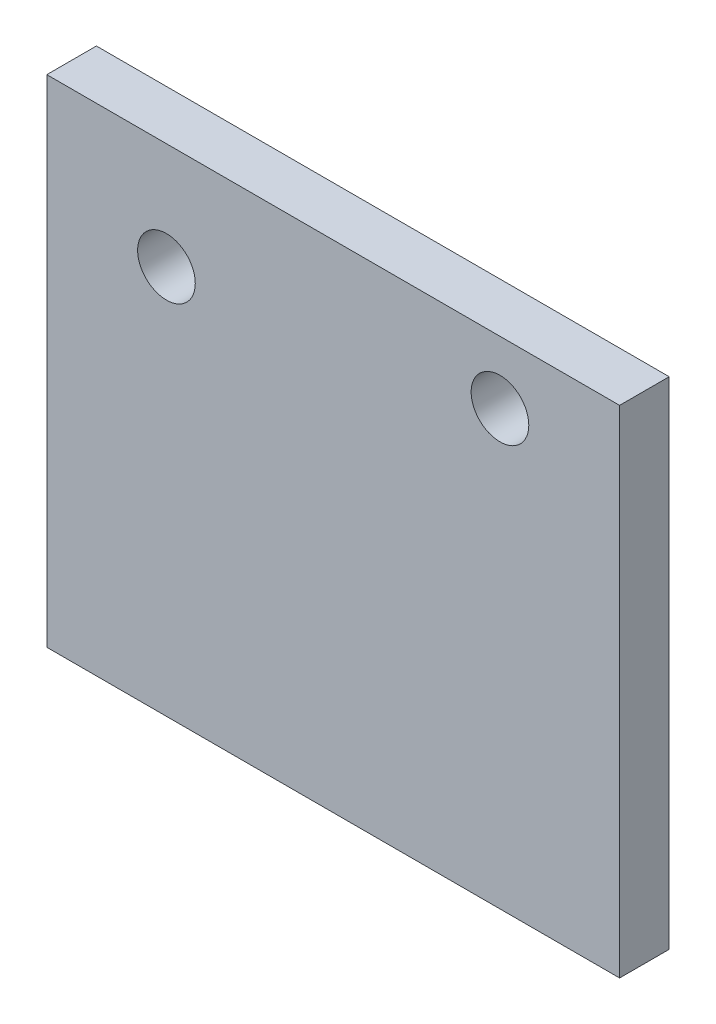
ISO-10303-21;
HEADER;
FILE_DESCRIPTION(('STEP AP214'),'2;1');
FILE_NAME('part.step','',(''),(''),'','','');
FILE_SCHEMA(('AUTOMOTIVE_DESIGN { 1 0 10303 214 1 1 1 1 }'));
ENDSEC;
DATA;
#1=APPLICATION_CONTEXT('core data for automotive mechanical design processes');
#2=APPLICATION_PROTOCOL_DEFINITION('international standard','automotive_design',2000,#1);
#3=PRODUCT_CONTEXT('',#1,'mechanical');
#4=PRODUCT('Part','Part','',(#3));
#5=PRODUCT_RELATED_PRODUCT_CATEGORY('part','',(#4));
#6=PRODUCT_DEFINITION_FORMATION('','',#4);
#7=PRODUCT_DEFINITION_CONTEXT('part definition',#1,'design');
#8=PRODUCT_DEFINITION('design','',#6,#7);
#9=PRODUCT_DEFINITION_SHAPE('','',#8);
#10=(LENGTH_UNIT() NAMED_UNIT(*) SI_UNIT(.MILLI.,.METRE.));
#11=(NAMED_UNIT(*) PLANE_ANGLE_UNIT() SI_UNIT($,.RADIAN.));
#12=(NAMED_UNIT(*) SI_UNIT($,.STERADIAN.) SOLID_ANGLE_UNIT());
#13=UNCERTAINTY_MEASURE_WITH_UNIT(LENGTH_MEASURE(1.E-05),#10,'distance_accuracy_value','');
#14=(GEOMETRIC_REPRESENTATION_CONTEXT(3) GLOBAL_UNCERTAINTY_ASSIGNED_CONTEXT((#13)) GLOBAL_UNIT_ASSIGNED_CONTEXT((#10,
#11,#12)) REPRESENTATION_CONTEXT('',''));
#15=CARTESIAN_POINT('',(0.,0.,0.));
#16=DIRECTION('',(0.,0.,1.));
#17=DIRECTION('',(1.,0.,0.));
#18=AXIS2_PLACEMENT_3D('',#15,#16,#17);
#19=CARTESIAN_POINT('',(0.,0.,40.));
#20=DIRECTION('',(1.,0.,0.));
#21=DIRECTION('',(0.,0.,-1.));
#22=AXIS2_PLACEMENT_3D('',#19,#20,#21);
#23=PLANE('',#22);
#24=DIRECTION('',(0.,-1.,0.));
#25=VECTOR('',#24,1.);
#26=CARTESIAN_POINT('',(0.,0.,0.));
#27=LINE('',#26,#25);
#28=CARTESIAN_POINT('',(0.,0.,0.));
#29=VERTEX_POINT('',#28);
#30=CARTESIAN_POINT('',(0.,-400.,0.));
#31=VERTEX_POINT('',#30);
#32=EDGE_CURVE('E147',#29,#31,#27,.T.);
#33=ORIENTED_EDGE('',*,*,#32,.T.);
#34=DIRECTION('',(0.,0.,-1.));
#35=VECTOR('',#34,1.);
#36=CARTESIAN_POINT('',(0.,-400.,40.));
#37=LINE('',#36,#35);
#38=CARTESIAN_POINT('',(0.,-400.,40.));
#39=VERTEX_POINT('',#38);
#40=EDGE_CURVE('E12',#39,#31,#37,.T.);
#41=ORIENTED_EDGE('',*,*,#40,.F.);
#42=DIRECTION('',(0.,-1.,0.));
#43=VECTOR('',#42,1.);
#44=CARTESIAN_POINT('',(0.,0.,40.));
#45=LINE('',#44,#43);
#46=CARTESIAN_POINT('',(0.,0.,40.));
#47=VERTEX_POINT('',#46);
#48=EDGE_CURVE('E101',#47,#39,#45,.T.);
#49=ORIENTED_EDGE('',*,*,#48,.F.);
#50=DIRECTION('',(0.,0.,-1.));
#51=VECTOR('',#50,1.);
#52=CARTESIAN_POINT('',(0.,0.,40.));
#53=LINE('',#52,#51);
#54=EDGE_CURVE('E65',#47,#29,#53,.T.);
#55=ORIENTED_EDGE('',*,*,#54,.T.);
#56=EDGE_LOOP('',(#33,#41,#49,#55));
#57=FACE_BOUND('',#56,.T.);
#58=ADVANCED_FACE('F49',(#57),#23,.F.);
#59=CARTESIAN_POINT('',(0.,-400.,40.));
#60=DIRECTION('',(0.,1.,0.));
#61=DIRECTION('',(0.,0.,1.));
#62=AXIS2_PLACEMENT_3D('',#59,#60,#61);
#63=PLANE('',#62);
#64=DIRECTION('',(1.,0.,0.));
#65=VECTOR('',#64,1.);
#66=CARTESIAN_POINT('',(0.,-400.,0.));
#67=LINE('',#66,#65);
#68=CARTESIAN_POINT('',(462.,-400.,0.));
#69=VERTEX_POINT('',#68);
#70=EDGE_CURVE('E106',#31,#69,#67,.T.);
#71=ORIENTED_EDGE('',*,*,#70,.T.);
#72=DIRECTION('',(0.,0.,-1.));
#73=VECTOR('',#72,1.);
#74=CARTESIAN_POINT('',(462.,-400.,40.));
#75=LINE('',#74,#73);
#76=CARTESIAN_POINT('',(462.,-400.,40.));
#77=VERTEX_POINT('',#76);
#78=EDGE_CURVE('E57',#77,#69,#75,.T.);
#79=ORIENTED_EDGE('',*,*,#78,.F.);
#80=DIRECTION('',(1.,0.,0.));
#81=VECTOR('',#80,1.);
#82=CARTESIAN_POINT('',(0.,-400.,40.));
#83=LINE('',#82,#81);
#84=EDGE_CURVE('E92',#39,#77,#83,.T.);
#85=ORIENTED_EDGE('',*,*,#84,.F.);
#86=ORIENTED_EDGE('',*,*,#40,.T.);
#87=EDGE_LOOP('',(#71,#79,#85,#86));
#88=FACE_BOUND('',#87,.T.);
#89=ADVANCED_FACE('F105',(#88),#63,.F.);
#90=CARTESIAN_POINT('',(462.,0.,40.));
#91=DIRECTION('',(1.,0.,0.));
#92=DIRECTION('',(0.,1.,0.));
#93=AXIS2_PLACEMENT_3D('',#90,#91,#92);
#94=PLANE('',#93);
#95=DIRECTION('',(0.,-1.,0.));
#96=VECTOR('',#95,1.);
#97=CARTESIAN_POINT('',(462.,0.,0.));
#98=LINE('',#97,#96);
#99=CARTESIAN_POINT('',(462.,0.,0.));
#100=VERTEX_POINT('',#99);
#101=EDGE_CURVE('E140',#100,#69,#98,.T.);
#102=ORIENTED_EDGE('',*,*,#101,.F.);
#103=DIRECTION('',(0.,0.,-1.));
#104=VECTOR('',#103,1.);
#105=CARTESIAN_POINT('',(462.,0.,40.));
#106=LINE('',#105,#104);
#107=CARTESIAN_POINT('',(462.,0.,40.));
#108=VERTEX_POINT('',#107);
#109=EDGE_CURVE('E81',#108,#100,#106,.T.);
#110=ORIENTED_EDGE('',*,*,#109,.F.);
#111=DIRECTION('',(0.,-1.,0.));
#112=VECTOR('',#111,1.);
#113=CARTESIAN_POINT('',(462.,0.,40.));
#114=LINE('',#113,#112);
#115=EDGE_CURVE('E100',#108,#77,#114,.T.);
#116=ORIENTED_EDGE('',*,*,#115,.T.);
#117=ORIENTED_EDGE('',*,*,#78,.T.);
#118=EDGE_LOOP('',(#102,#110,#116,#117));
#119=FACE_BOUND('',#118,.T.);
#120=ADVANCED_FACE('F109',(#119),#94,.T.);
#121=CARTESIAN_POINT('',(365.5,-50.5,40.));
#122=DIRECTION('',(0.,0.,-1.));
#123=DIRECTION('',(-1.,0.,0.));
#124=AXIS2_PLACEMENT_3D('',#121,#122,#123);
#125=CYLINDRICAL_SURFACE('',#124,23.25);
#126=CARTESIAN_POINT('',(365.5,-50.5,40.));
#127=DIRECTION('',(0.,0.,1.));
#128=DIRECTION('',(1.,0.,0.));
#129=AXIS2_PLACEMENT_3D('',#126,#127,#128);
#130=CIRCLE('',#129,23.25);
#131=CARTESIAN_POINT('',(388.75,-50.5,40.));
#132=VERTEX_POINT('',#131);
#133=EDGE_CURVE('E113',#132,#132,#130,.T.);
#134=ORIENTED_EDGE('',*,*,#133,.T.);
#135=EDGE_LOOP('',(#134));
#136=FACE_BOUND('',#135,.T.);
#137=CARTESIAN_POINT('',(365.5,-50.5,0.));
#138=DIRECTION('',(0.,0.,1.));
#139=DIRECTION('',(1.,0.,0.));
#140=AXIS2_PLACEMENT_3D('',#137,#138,#139);
#141=CIRCLE('',#140,23.25);
#142=CARTESIAN_POINT('',(388.75,-50.5,0.));
#143=VERTEX_POINT('',#142);
#144=EDGE_CURVE('E134',#143,#143,#141,.T.);
#145=ORIENTED_EDGE('',*,*,#144,.F.);
#146=EDGE_LOOP('',(#145));
#147=FACE_BOUND('',#146,.T.);
#148=ADVANCED_FACE('F159',(#136,#147),#125,.F.);
#149=CARTESIAN_POINT('',(0.,0.,40.));
#150=DIRECTION('',(0.,1.,0.));
#151=DIRECTION('',(0.,0.,1.));
#152=AXIS2_PLACEMENT_3D('',#149,#150,#151);
#153=PLANE('',#152);
#154=DIRECTION('',(1.,0.,0.));
#155=VECTOR('',#154,1.);
#156=CARTESIAN_POINT('',(0.,0.,0.));
#157=LINE('',#156,#155);
#158=EDGE_CURVE('E137',#29,#100,#157,.T.);
#159=ORIENTED_EDGE('',*,*,#158,.F.);
#160=ORIENTED_EDGE('',*,*,#54,.F.);
#161=DIRECTION('',(1.,0.,0.));
#162=VECTOR('',#161,1.);
#163=CARTESIAN_POINT('',(0.,0.,40.));
#164=LINE('',#163,#162);
#165=EDGE_CURVE('E110',#47,#108,#164,.T.);
#166=ORIENTED_EDGE('',*,*,#165,.T.);
#167=ORIENTED_EDGE('',*,*,#109,.T.);
#168=EDGE_LOOP('',(#159,#160,#166,#167));
#169=FACE_BOUND('',#168,.T.);
#170=ADVANCED_FACE('F156',(#169),#153,.T.);
#171=CARTESIAN_POINT('',(96.5,-86.,40.));
#172=DIRECTION('',(0.,0.,-1.));
#173=DIRECTION('',(-1.,0.,0.));
#174=AXIS2_PLACEMENT_3D('',#171,#172,#173);
#175=CYLINDRICAL_SURFACE('',#174,23.25);
#176=CARTESIAN_POINT('',(96.5,-86.,40.));
#177=DIRECTION('',(0.,0.,1.));
#178=DIRECTION('',(1.,0.,0.));
#179=AXIS2_PLACEMENT_3D('',#176,#177,#178);
#180=CIRCLE('',#179,23.25);
#181=CARTESIAN_POINT('',(119.75,-86.,40.));
#182=VERTEX_POINT('',#181);
#183=EDGE_CURVE('E130',#182,#182,#180,.T.);
#184=ORIENTED_EDGE('',*,*,#183,.T.);
#185=EDGE_LOOP('',(#184));
#186=FACE_BOUND('',#185,.T.);
#187=CARTESIAN_POINT('',(96.5,-86.,0.));
#188=DIRECTION('',(0.,0.,1.));
#189=DIRECTION('',(1.,0.,0.));
#190=AXIS2_PLACEMENT_3D('',#187,#188,#189);
#191=CIRCLE('',#190,23.25);
#192=CARTESIAN_POINT('',(119.75,-86.,0.));
#193=VERTEX_POINT('',#192);
#194=EDGE_CURVE('E131',#193,#193,#191,.T.);
#195=ORIENTED_EDGE('',*,*,#194,.F.);
#196=EDGE_LOOP('',(#195));
#197=FACE_BOUND('',#196,.T.);
#198=ADVANCED_FACE('F158',(#186,#197),#175,.F.);
#199=CARTESIAN_POINT('',(0.,0.,40.));
#200=DIRECTION('',(0.,0.,1.));
#201=DIRECTION('',(1.,0.,0.));
#202=AXIS2_PLACEMENT_3D('',#199,#200,#201);
#203=PLANE('',#202);
#204=ORIENTED_EDGE('',*,*,#48,.T.);
#205=ORIENTED_EDGE('',*,*,#84,.T.);
#206=ORIENTED_EDGE('',*,*,#115,.F.);
#207=ORIENTED_EDGE('',*,*,#165,.F.);
#208=EDGE_LOOP('',(#204,#205,#206,#207));
#209=FACE_BOUND('',#208,.T.);
#210=ORIENTED_EDGE('',*,*,#133,.F.);
#211=EDGE_LOOP('',(#210));
#212=FACE_BOUND('',#211,.T.);
#213=ORIENTED_EDGE('',*,*,#183,.F.);
#214=EDGE_LOOP('',(#213));
#215=FACE_BOUND('',#214,.T.);
#216=ADVANCED_FACE('F96',(#209,#212,#215),#203,.T.);
#217=CARTESIAN_POINT('',(0.,0.,0.));
#218=DIRECTION('',(0.,0.,1.));
#219=DIRECTION('',(1.,0.,0.));
#220=AXIS2_PLACEMENT_3D('',#217,#218,#219);
#221=PLANE('',#220);
#222=ORIENTED_EDGE('',*,*,#32,.F.);
#223=ORIENTED_EDGE('',*,*,#158,.T.);
#224=ORIENTED_EDGE('',*,*,#101,.T.);
#225=ORIENTED_EDGE('',*,*,#70,.F.);
#226=EDGE_LOOP('',(#222,#223,#224,#225));
#227=FACE_BOUND('',#226,.T.);
#228=ORIENTED_EDGE('',*,*,#144,.T.);
#229=EDGE_LOOP('',(#228));
#230=FACE_BOUND('',#229,.T.);
#231=ORIENTED_EDGE('',*,*,#194,.T.);
#232=EDGE_LOOP('',(#231));
#233=FACE_BOUND('',#232,.T.);
#234=ADVANCED_FACE('F154',(#227,#230,#233),#221,.F.);
#235=CLOSED_SHELL('',(#58,#89,#120,#148,#170,#198,#216,#234));
#236=MANIFOLD_SOLID_BREP('B2',#235);
#237=ADVANCED_BREP_SHAPE_REPRESENTATION('',(#18,#236),#14);
#238=SHAPE_DEFINITION_REPRESENTATION(#9,#237);
ENDSEC;
END-ISO-10303-21;
